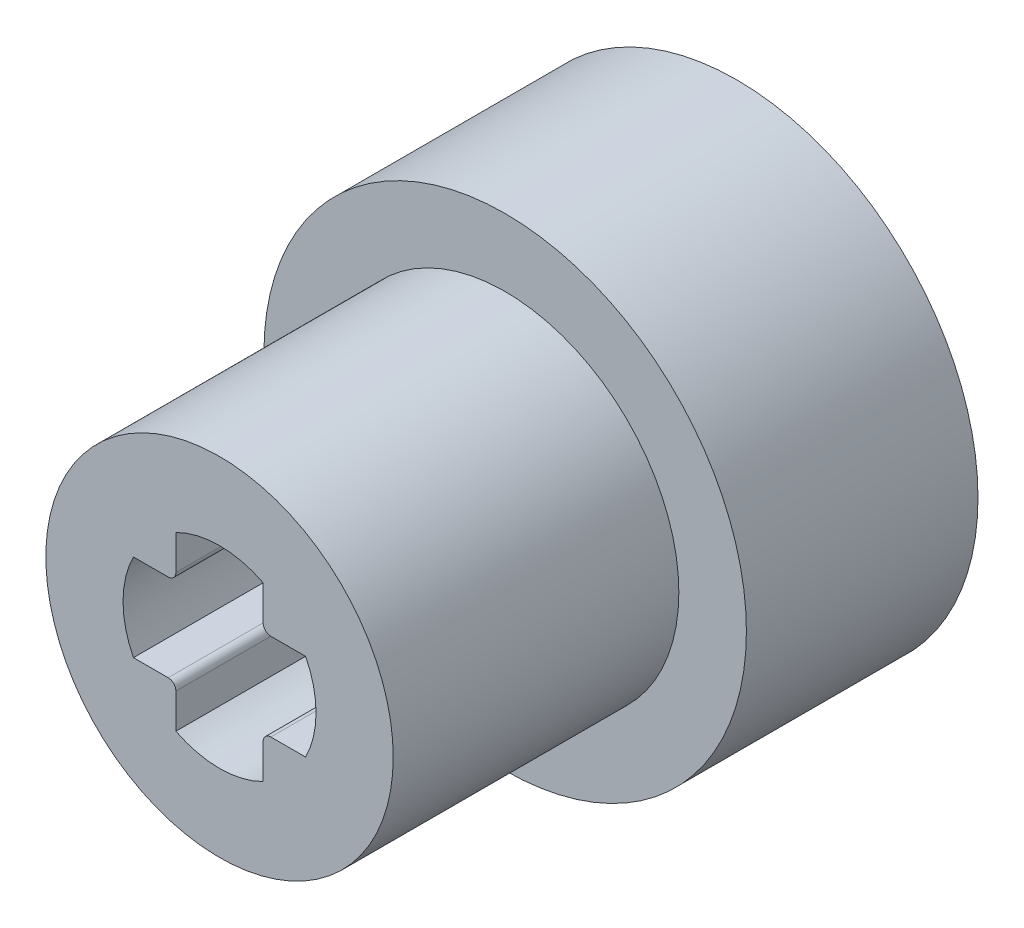
ISO-10303-21;
HEADER;
FILE_DESCRIPTION(('STEP AP214'),'2;1');
FILE_NAME('part.step','',(''),(''),'','','');
FILE_SCHEMA(('AUTOMOTIVE_DESIGN { 1 0 10303 214 1 1 1 1 }'));
ENDSEC;
DATA;
#1=APPLICATION_CONTEXT('core data for automotive mechanical design processes');
#2=APPLICATION_PROTOCOL_DEFINITION('international standard','automotive_design',2000,#1);
#3=PRODUCT_CONTEXT('',#1,'mechanical');
#4=PRODUCT('Part','Part','',(#3));
#5=PRODUCT_RELATED_PRODUCT_CATEGORY('part','',(#4));
#6=PRODUCT_DEFINITION_FORMATION('','',#4);
#7=PRODUCT_DEFINITION_CONTEXT('part definition',#1,'design');
#8=PRODUCT_DEFINITION('design','',#6,#7);
#9=PRODUCT_DEFINITION_SHAPE('','',#8);
#10=(LENGTH_UNIT() NAMED_UNIT(*) SI_UNIT(.MILLI.,.METRE.));
#11=(NAMED_UNIT(*) PLANE_ANGLE_UNIT() SI_UNIT($,.RADIAN.));
#12=(NAMED_UNIT(*) SI_UNIT($,.STERADIAN.) SOLID_ANGLE_UNIT());
#13=UNCERTAINTY_MEASURE_WITH_UNIT(LENGTH_MEASURE(1.E-05),#10,'distance_accuracy_value','');
#14=(GEOMETRIC_REPRESENTATION_CONTEXT(3) GLOBAL_UNCERTAINTY_ASSIGNED_CONTEXT((#13)) GLOBAL_UNIT_ASSIGNED_CONTEXT((#10,
#11,#12)) REPRESENTATION_CONTEXT('',''));
#15=CARTESIAN_POINT('',(0.,0.,0.));
#16=DIRECTION('',(0.,0.,1.));
#17=DIRECTION('',(1.,0.,0.));
#18=AXIS2_PLACEMENT_3D('',#15,#16,#17);
#19=CARTESIAN_POINT('',(0.,0.,0.));
#20=DIRECTION('',(0.,0.,1.));
#21=DIRECTION('',(1.,0.,0.));
#22=AXIS2_PLACEMENT_3D('',#19,#20,#21);
#23=PLANE('',#22);
#24=CARTESIAN_POINT('',(0.,0.,0.));
#25=DIRECTION('',(0.,0.,1.));
#26=DIRECTION('',(1.,0.,0.));
#27=AXIS2_PLACEMENT_3D('',#24,#25,#26);
#28=CIRCLE('',#27,6.25);
#29=CARTESIAN_POINT('',(6.25,0.,0.));
#30=VERTEX_POINT('',#29);
#31=EDGE_CURVE('E298',#30,#30,#28,.T.);
#32=ORIENTED_EDGE('',*,*,#31,.F.);
#33=EDGE_LOOP('',(#32));
#34=FACE_BOUND('',#33,.T.);
#35=CARTESIAN_POINT('',(0.,0.,0.));
#36=DIRECTION('',(0.,0.,1.));
#37=DIRECTION('',(1.,0.,0.));
#38=AXIS2_PLACEMENT_3D('',#35,#36,#37);
#39=CIRCLE('',#38,1.25);
#40=CARTESIAN_POINT('',(1.25,0.,0.));
#41=VERTEX_POINT('',#40);
#42=EDGE_CURVE('E304',#41,#41,#39,.T.);
#43=ORIENTED_EDGE('',*,*,#42,.T.);
#44=EDGE_LOOP('',(#43));
#45=FACE_BOUND('',#44,.T.);
#46=ADVANCED_FACE('F95',(#34,#45),#23,.F.);
#47=CARTESIAN_POINT('',(0.,0.,5.));
#48=DIRECTION('',(0.,0.,-1.));
#49=DIRECTION('',(-1.,0.,0.));
#50=AXIS2_PLACEMENT_3D('',#47,#48,#49);
#51=CYLINDRICAL_SURFACE('',#50,6.25);
#52=ORIENTED_EDGE('',*,*,#31,.T.);
#53=EDGE_LOOP('',(#52));
#54=FACE_BOUND('',#53,.T.);
#55=CARTESIAN_POINT('',(0.,0.,6.));
#56=DIRECTION('',(0.,0.,1.));
#57=DIRECTION('',(1.,0.,0.));
#58=AXIS2_PLACEMENT_3D('',#55,#56,#57);
#59=CIRCLE('',#58,6.25);
#60=CARTESIAN_POINT('',(6.25,0.,6.));
#61=VERTEX_POINT('',#60);
#62=EDGE_CURVE('E293',#61,#61,#59,.T.);
#63=ORIENTED_EDGE('',*,*,#62,.F.);
#64=EDGE_LOOP('',(#63));
#65=FACE_BOUND('',#64,.T.);
#66=ADVANCED_FACE('F386',(#54,#65),#51,.T.);
#67=CARTESIAN_POINT('',(0.,0.,5.));
#68=DIRECTION('',(0.,0.,-1.));
#69=DIRECTION('',(-1.,0.,0.));
#70=AXIS2_PLACEMENT_3D('',#67,#68,#69);
#71=CYLINDRICAL_SURFACE('',#70,1.25);
#72=CARTESIAN_POINT('',(0.,0.,5.));
#73=DIRECTION('',(0.,0.,1.));
#74=DIRECTION('',(1.,0.,0.));
#75=AXIS2_PLACEMENT_3D('',#72,#73,#74);
#76=CIRCLE('',#75,1.25);
#77=CARTESIAN_POINT('',(1.25,0.,5.));
#78=VERTEX_POINT('',#77);
#79=EDGE_CURVE('E301',#78,#78,#76,.T.);
#80=ORIENTED_EDGE('',*,*,#79,.T.);
#81=EDGE_LOOP('',(#80));
#82=FACE_BOUND('',#81,.T.);
#83=ORIENTED_EDGE('',*,*,#42,.F.);
#84=EDGE_LOOP('',(#83));
#85=FACE_BOUND('',#84,.T.);
#86=ADVANCED_FACE('F392',(#82,#85),#71,.F.);
#87=CARTESIAN_POINT('',(0.,0.,5.));
#88=DIRECTION('',(0.,0.,1.));
#89=DIRECTION('',(1.,0.,0.));
#90=AXIS2_PLACEMENT_3D('',#87,#88,#89);
#91=PLANE('',#90);
#92=ORIENTED_EDGE('',*,*,#79,.F.);
#93=EDGE_LOOP('',(#92));
#94=FACE_BOUND('',#93,.T.);
#95=ADVANCED_FACE('F549',(#94),#91,.F.);
#96=CARTESIAN_POINT('',(0.,0.,6.));
#97=DIRECTION('',(0.,0.,1.));
#98=DIRECTION('',(1.,0.,0.));
#99=AXIS2_PLACEMENT_3D('',#96,#97,#98);
#100=PLANE('',#99);
#101=CARTESIAN_POINT('',(0.,0.,6.));
#102=DIRECTION('',(0.,0.,1.));
#103=DIRECTION('',(1.,0.,0.));
#104=AXIS2_PLACEMENT_3D('',#101,#102,#103);
#105=CIRCLE('',#104,4.5);
#106=CARTESIAN_POINT('',(4.5,0.,6.));
#107=VERTEX_POINT('',#106);
#108=EDGE_CURVE('E294',#107,#107,#105,.T.);
#109=ORIENTED_EDGE('',*,*,#108,.F.);
#110=EDGE_LOOP('',(#109));
#111=FACE_BOUND('',#110,.T.);
#112=ORIENTED_EDGE('',*,*,#62,.T.);
#113=EDGE_LOOP('',(#112));
#114=FACE_BOUND('',#113,.T.);
#115=ADVANCED_FACE('F539',(#111,#114),#100,.T.);
#116=CARTESIAN_POINT('',(0.,0.,13.4));
#117=DIRECTION('',(0.,0.,-1.));
#118=DIRECTION('',(-1.,0.,0.));
#119=AXIS2_PLACEMENT_3D('',#116,#117,#118);
#120=CYLINDRICAL_SURFACE('',#119,4.5);
#121=CARTESIAN_POINT('',(0.,0.,13.4));
#122=DIRECTION('',(0.,0.,1.));
#123=DIRECTION('',(1.,0.,0.));
#124=AXIS2_PLACEMENT_3D('',#121,#122,#123);
#125=CIRCLE('',#124,4.5);
#126=CARTESIAN_POINT('',(4.5,0.,13.4));
#127=VERTEX_POINT('',#126);
#128=EDGE_CURVE('E233',#127,#127,#125,.T.);
#129=ORIENTED_EDGE('',*,*,#128,.F.);
#130=EDGE_LOOP('',(#129));
#131=FACE_BOUND('',#130,.T.);
#132=ORIENTED_EDGE('',*,*,#108,.T.);
#133=EDGE_LOOP('',(#132));
#134=FACE_BOUND('',#133,.T.);
#135=ADVANCED_FACE('F505',(#131,#134),#120,.T.);
#136=CARTESIAN_POINT('',(0.,0.,13.4));
#137=DIRECTION('',(0.,0.,1.));
#138=DIRECTION('',(1.,0.,0.));
#139=AXIS2_PLACEMENT_3D('',#136,#137,#138);
#140=PLANE('',#139);
#141=DIRECTION('',(0.,-1.,0.));
#142=VECTOR('',#141,1.);
#143=CARTESIAN_POINT('',(-1.13002976164114,0.,13.4));
#144=LINE('',#143,#142);
#145=CARTESIAN_POINT('',(-1.13002976164114,-1.33002976164114,13.4));
#146=VERTEX_POINT('',#145);
#147=CARTESIAN_POINT('',(-1.13002976164115,-2.23002976164114,13.4));
#148=VERTEX_POINT('',#147);
#149=EDGE_CURVE('E222',#146,#148,#144,.T.);
#150=ORIENTED_EDGE('',*,*,#149,.F.);
#151=CARTESIAN_POINT('',(-1.33002976164114,-1.33002976164114,13.4));
#152=DIRECTION('',(0.,0.,1.));
#153=DIRECTION('',(1.,0.,0.));
#154=AXIS2_PLACEMENT_3D('',#151,#152,#153);
#155=CIRCLE('',#154,0.2);
#156=CARTESIAN_POINT('',(-1.33002976164114,-1.13002976164114,13.4));
#157=VERTEX_POINT('',#156);
#158=EDGE_CURVE('E319',#146,#157,#155,.T.);
#159=ORIENTED_EDGE('',*,*,#158,.T.);
#160=DIRECTION('',(-1.,0.,0.));
#161=VECTOR('',#160,1.);
#162=CARTESIAN_POINT('',(0.,-1.13002976164114,13.4));
#163=LINE('',#162,#161);
#164=CARTESIAN_POINT('',(-2.23002976164114,-1.13002976164114,13.4));
#165=VERTEX_POINT('',#164);
#166=EDGE_CURVE('E288',#157,#165,#163,.T.);
#167=ORIENTED_EDGE('',*,*,#166,.T.);
#168=CARTESIAN_POINT('',(0.,0.,13.4));
#169=DIRECTION('',(0.,0.,1.));
#170=DIRECTION('',(1.,0.,0.));
#171=AXIS2_PLACEMENT_3D('',#168,#169,#170);
#172=CIRCLE('',#171,2.5);
#173=CARTESIAN_POINT('',(-2.23002976164114,1.13002976164114,13.4));
#174=VERTEX_POINT('',#173);
#175=EDGE_CURVE('E249',#174,#165,#172,.T.);
#176=ORIENTED_EDGE('',*,*,#175,.F.);
#177=DIRECTION('',(-1.,0.,0.));
#178=VECTOR('',#177,1.);
#179=CARTESIAN_POINT('',(0.,1.13002976164114,13.4));
#180=LINE('',#179,#178);
#181=CARTESIAN_POINT('',(-1.33002976164114,1.13002976164114,13.4));
#182=VERTEX_POINT('',#181);
#183=EDGE_CURVE('E287',#182,#174,#180,.T.);
#184=ORIENTED_EDGE('',*,*,#183,.F.);
#185=CARTESIAN_POINT('',(-1.33002976164114,1.33002976164114,13.4));
#186=DIRECTION('',(0.,0.,1.));
#187=DIRECTION('',(1.,0.,0.));
#188=AXIS2_PLACEMENT_3D('',#185,#186,#187);
#189=CIRCLE('',#188,0.2);
#190=CARTESIAN_POINT('',(-1.13002976164114,1.33002976164114,13.4));
#191=VERTEX_POINT('',#190);
#192=EDGE_CURVE('E315',#182,#191,#189,.T.);
#193=ORIENTED_EDGE('',*,*,#192,.T.);
#194=CARTESIAN_POINT('',(-1.13002976164114,2.23002976164114,13.4));
#195=VERTEX_POINT('',#194);
#196=EDGE_CURVE('E275',#195,#191,#144,.T.);
#197=ORIENTED_EDGE('',*,*,#196,.F.);
#198=CARTESIAN_POINT('',(0.,0.,13.4));
#199=DIRECTION('',(0.,0.,1.));
#200=DIRECTION('',(1.,0.,0.));
#201=AXIS2_PLACEMENT_3D('',#198,#199,#200);
#202=CIRCLE('',#201,2.5);
#203=CARTESIAN_POINT('',(1.13002976164115,2.23002976164114,13.4));
#204=VERTEX_POINT('',#203);
#205=EDGE_CURVE('E239',#204,#195,#202,.T.);
#206=ORIENTED_EDGE('',*,*,#205,.F.);
#207=DIRECTION('',(0.,-1.,0.));
#208=VECTOR('',#207,1.);
#209=CARTESIAN_POINT('',(1.13002976164114,0.,13.4));
#210=LINE('',#209,#208);
#211=CARTESIAN_POINT('',(1.13002976164114,1.33002976164114,13.4));
#212=VERTEX_POINT('',#211);
#213=EDGE_CURVE('E279',#204,#212,#210,.T.);
#214=ORIENTED_EDGE('',*,*,#213,.T.);
#215=CARTESIAN_POINT('',(1.33002976164114,1.33002976164114,13.4));
#216=DIRECTION('',(0.,0.,1.));
#217=DIRECTION('',(1.,0.,0.));
#218=AXIS2_PLACEMENT_3D('',#215,#216,#217);
#219=CIRCLE('',#218,0.2);
#220=CARTESIAN_POINT('',(1.33002976164114,1.13002976164114,13.4));
#221=VERTEX_POINT('',#220);
#222=EDGE_CURVE('E313',#212,#221,#219,.T.);
#223=ORIENTED_EDGE('',*,*,#222,.T.);
#224=CARTESIAN_POINT('',(2.23002976164114,1.13002976164114,13.4));
#225=VERTEX_POINT('',#224);
#226=EDGE_CURVE('E289',#225,#221,#180,.T.);
#227=ORIENTED_EDGE('',*,*,#226,.F.);
#228=CARTESIAN_POINT('',(0.,0.,13.4));
#229=DIRECTION('',(0.,0.,1.));
#230=DIRECTION('',(1.,0.,0.));
#231=AXIS2_PLACEMENT_3D('',#228,#229,#230);
#232=CIRCLE('',#231,2.5);
#233=CARTESIAN_POINT('',(2.23002976164114,-1.13002976164115,13.4));
#234=VERTEX_POINT('',#233);
#235=EDGE_CURVE('E213',#234,#225,#232,.T.);
#236=ORIENTED_EDGE('',*,*,#235,.F.);
#237=CARTESIAN_POINT('',(1.33002976164114,-1.13002976164114,13.4));
#238=VERTEX_POINT('',#237);
#239=EDGE_CURVE('E284',#234,#238,#163,.T.);
#240=ORIENTED_EDGE('',*,*,#239,.T.);
#241=CARTESIAN_POINT('',(1.33002976164114,-1.33002976164114,13.4));
#242=DIRECTION('',(0.,0.,1.));
#243=DIRECTION('',(1.,0.,0.));
#244=AXIS2_PLACEMENT_3D('',#241,#242,#243);
#245=CIRCLE('',#244,0.2);
#246=CARTESIAN_POINT('',(1.13002976164114,-1.33002976164114,13.4));
#247=VERTEX_POINT('',#246);
#248=EDGE_CURVE('E317',#238,#247,#245,.T.);
#249=ORIENTED_EDGE('',*,*,#248,.T.);
#250=CARTESIAN_POINT('',(1.13002976164114,-2.23002976164114,13.4));
#251=VERTEX_POINT('',#250);
#252=EDGE_CURVE('E278',#247,#251,#210,.T.);
#253=ORIENTED_EDGE('',*,*,#252,.T.);
#254=CARTESIAN_POINT('',(0.,0.,13.4));
#255=DIRECTION('',(0.,0.,1.));
#256=DIRECTION('',(1.,0.,0.));
#257=AXIS2_PLACEMENT_3D('',#254,#255,#256);
#258=CIRCLE('',#257,2.5);
#259=EDGE_CURVE('E261',#148,#251,#258,.T.);
#260=ORIENTED_EDGE('',*,*,#259,.F.);
#261=EDGE_LOOP('',(#150,#159,#167,#176,#184,#193,#197,#206,#214,#223,#227,#236,#240,#249,#253,#260));
#262=FACE_BOUND('',#261,.T.);
#263=ORIENTED_EDGE('',*,*,#128,.T.);
#264=EDGE_LOOP('',(#263));
#265=FACE_BOUND('',#264,.T.);
#266=ADVANCED_FACE('F352',(#262,#265),#140,.T.);
#267=CARTESIAN_POINT('',(0.,0.,6.));
#268=DIRECTION('',(0.,0.,1.));
#269=DIRECTION('',(1.,0.,0.));
#270=AXIS2_PLACEMENT_3D('',#267,#268,#269);
#271=CYLINDRICAL_SURFACE('',#270,2.5);
#272=ORIENTED_EDGE('',*,*,#235,.T.);
#273=DIRECTION('',(0.,0.,1.));
#274=VECTOR('',#273,1.);
#275=CARTESIAN_POINT('',(2.23002976164114,1.13002976164114,6.));
#276=LINE('',#275,#274);
#277=CARTESIAN_POINT('',(2.23002976164114,1.13002976164114,6.));
#278=VERTEX_POINT('',#277);
#279=EDGE_CURVE('E207',#278,#225,#276,.T.);
#280=ORIENTED_EDGE('',*,*,#279,.F.);
#281=CARTESIAN_POINT('',(0.,0.,6.));
#282=DIRECTION('',(0.,0.,1.));
#283=DIRECTION('',(1.,0.,0.));
#284=AXIS2_PLACEMENT_3D('',#281,#282,#283);
#285=CIRCLE('',#284,2.5);
#286=CARTESIAN_POINT('',(2.23002976164114,-1.13002976164115,6.));
#287=VERTEX_POINT('',#286);
#288=EDGE_CURVE('E211',#287,#278,#285,.T.);
#289=ORIENTED_EDGE('',*,*,#288,.F.);
#290=DIRECTION('',(0.,0.,1.));
#291=VECTOR('',#290,1.);
#292=CARTESIAN_POINT('',(2.23002976164114,-1.13002976164115,6.));
#293=LINE('',#292,#291);
#294=EDGE_CURVE('E217',#287,#234,#293,.T.);
#295=ORIENTED_EDGE('',*,*,#294,.T.);
#296=EDGE_LOOP('',(#272,#280,#289,#295));
#297=FACE_BOUND('',#296,.T.);
#298=ADVANCED_FACE('F209',(#297),#271,.F.);
#299=CARTESIAN_POINT('',(0.,0.,6.));
#300=DIRECTION('',(0.,0.,1.));
#301=DIRECTION('',(1.,0.,0.));
#302=AXIS2_PLACEMENT_3D('',#299,#300,#301);
#303=PLANE('',#302);
#304=ORIENTED_EDGE('',*,*,#288,.T.);
#305=DIRECTION('',(-1.,0.,0.));
#306=VECTOR('',#305,1.);
#307=CARTESIAN_POINT('',(0.,1.13002976164114,6.));
#308=LINE('',#307,#306);
#309=CARTESIAN_POINT('',(1.33002976164114,1.13002976164114,6.));
#310=VERTEX_POINT('',#309);
#311=EDGE_CURVE('E219',#278,#310,#308,.T.);
#312=ORIENTED_EDGE('',*,*,#311,.T.);
#313=CARTESIAN_POINT('',(1.33002976164114,1.33002976164114,6.));
#314=DIRECTION('',(0.,0.,1.));
#315=DIRECTION('',(1.,0.,0.));
#316=AXIS2_PLACEMENT_3D('',#313,#314,#315);
#317=CIRCLE('',#316,0.2);
#318=CARTESIAN_POINT('',(1.13002976164114,1.33002976164114,6.));
#319=VERTEX_POINT('',#318);
#320=EDGE_CURVE('E12',#310,#319,#317,.F.);
#321=ORIENTED_EDGE('',*,*,#320,.T.);
#322=DIRECTION('',(0.,-1.,0.));
#323=VECTOR('',#322,1.);
#324=CARTESIAN_POINT('',(1.13002976164114,0.,6.));
#325=LINE('',#324,#323);
#326=CARTESIAN_POINT('',(1.13002976164115,2.23002976164114,6.));
#327=VERTEX_POINT('',#326);
#328=EDGE_CURVE('E264',#327,#319,#325,.T.);
#329=ORIENTED_EDGE('',*,*,#328,.F.);
#330=CARTESIAN_POINT('',(0.,0.,6.));
#331=DIRECTION('',(0.,0.,1.));
#332=DIRECTION('',(1.,0.,0.));
#333=AXIS2_PLACEMENT_3D('',#330,#331,#332);
#334=CIRCLE('',#333,2.5);
#335=CARTESIAN_POINT('',(-1.13002976164114,2.23002976164114,6.));
#336=VERTEX_POINT('',#335);
#337=EDGE_CURVE('E235',#327,#336,#334,.T.);
#338=ORIENTED_EDGE('',*,*,#337,.T.);
#339=DIRECTION('',(0.,-1.,0.));
#340=VECTOR('',#339,1.);
#341=CARTESIAN_POINT('',(-1.13002976164114,0.,6.));
#342=LINE('',#341,#340);
#343=CARTESIAN_POINT('',(-1.13002976164114,1.33002976164114,6.));
#344=VERTEX_POINT('',#343);
#345=EDGE_CURVE('E269',#336,#344,#342,.T.);
#346=ORIENTED_EDGE('',*,*,#345,.T.);
#347=CARTESIAN_POINT('',(-1.33002976164114,1.33002976164114,6.));
#348=DIRECTION('',(0.,0.,1.));
#349=DIRECTION('',(1.,0.,0.));
#350=AXIS2_PLACEMENT_3D('',#347,#348,#349);
#351=CIRCLE('',#350,0.2);
#352=CARTESIAN_POINT('',(-1.33002976164114,1.13002976164114,6.));
#353=VERTEX_POINT('',#352);
#354=EDGE_CURVE('E103',#344,#353,#351,.F.);
#355=ORIENTED_EDGE('',*,*,#354,.T.);
#356=CARTESIAN_POINT('',(-2.23002976164114,1.13002976164114,6.));
#357=VERTEX_POINT('',#356);
#358=EDGE_CURVE('E223',#353,#357,#308,.T.);
#359=ORIENTED_EDGE('',*,*,#358,.T.);
#360=CARTESIAN_POINT('',(0.,0.,6.));
#361=DIRECTION('',(0.,0.,1.));
#362=DIRECTION('',(1.,0.,0.));
#363=AXIS2_PLACEMENT_3D('',#360,#361,#362);
#364=CIRCLE('',#363,2.5);
#365=CARTESIAN_POINT('',(-2.23002976164114,-1.13002976164114,6.));
#366=VERTEX_POINT('',#365);
#367=EDGE_CURVE('E245',#357,#366,#364,.T.);
#368=ORIENTED_EDGE('',*,*,#367,.T.);
#369=DIRECTION('',(-1.,0.,0.));
#370=VECTOR('',#369,1.);
#371=CARTESIAN_POINT('',(0.,-1.13002976164114,6.));
#372=LINE('',#371,#370);
#373=CARTESIAN_POINT('',(-1.33002976164114,-1.13002976164114,6.));
#374=VERTEX_POINT('',#373);
#375=EDGE_CURVE('E282',#374,#366,#372,.T.);
#376=ORIENTED_EDGE('',*,*,#375,.F.);
#377=CARTESIAN_POINT('',(-1.33002976164114,-1.33002976164114,6.));
#378=DIRECTION('',(0.,0.,1.));
#379=DIRECTION('',(1.,0.,0.));
#380=AXIS2_PLACEMENT_3D('',#377,#378,#379);
#381=CIRCLE('',#380,0.2);
#382=CARTESIAN_POINT('',(-1.13002976164114,-1.33002976164114,6.));
#383=VERTEX_POINT('',#382);
#384=EDGE_CURVE('E334',#374,#383,#381,.F.);
#385=ORIENTED_EDGE('',*,*,#384,.T.);
#386=CARTESIAN_POINT('',(-1.13002976164115,-2.23002976164114,6.));
#387=VERTEX_POINT('',#386);
#388=EDGE_CURVE('E273',#383,#387,#342,.T.);
#389=ORIENTED_EDGE('',*,*,#388,.T.);
#390=CARTESIAN_POINT('',(0.,0.,6.));
#391=DIRECTION('',(0.,0.,1.));
#392=DIRECTION('',(1.,0.,0.));
#393=AXIS2_PLACEMENT_3D('',#390,#391,#392);
#394=CIRCLE('',#393,2.5);
#395=CARTESIAN_POINT('',(1.13002976164114,-2.23002976164114,6.));
#396=VERTEX_POINT('',#395);
#397=EDGE_CURVE('E257',#387,#396,#394,.T.);
#398=ORIENTED_EDGE('',*,*,#397,.T.);
#399=CARTESIAN_POINT('',(1.13002976164114,-1.33002976164114,6.));
#400=VERTEX_POINT('',#399);
#401=EDGE_CURVE('E272',#400,#396,#325,.T.);
#402=ORIENTED_EDGE('',*,*,#401,.F.);
#403=CARTESIAN_POINT('',(1.33002976164114,-1.33002976164114,6.));
#404=DIRECTION('',(0.,0.,1.));
#405=DIRECTION('',(1.,0.,0.));
#406=AXIS2_PLACEMENT_3D('',#403,#404,#405);
#407=CIRCLE('',#406,0.2);
#408=CARTESIAN_POINT('',(1.33002976164114,-1.13002976164114,6.));
#409=VERTEX_POINT('',#408);
#410=EDGE_CURVE('E336',#400,#409,#407,.F.);
#411=ORIENTED_EDGE('',*,*,#410,.T.);
#412=EDGE_CURVE('E228',#287,#409,#372,.T.);
#413=ORIENTED_EDGE('',*,*,#412,.F.);
#414=EDGE_LOOP('',(#304,#312,#321,#329,#338,#346,#355,#359,#368,#376,#385,#389,#398,#402,#411,#413));
#415=FACE_BOUND('',#414,.T.);
#416=ADVANCED_FACE('F226',(#415),#303,.T.);
#417=CARTESIAN_POINT('',(0.,0.,6.));
#418=DIRECTION('',(0.,0.,1.));
#419=DIRECTION('',(1.,0.,0.));
#420=AXIS2_PLACEMENT_3D('',#417,#418,#419);
#421=CYLINDRICAL_SURFACE('',#420,2.5);
#422=ORIENTED_EDGE('',*,*,#175,.T.);
#423=DIRECTION('',(0.,0.,1.));
#424=VECTOR('',#423,1.);
#425=CARTESIAN_POINT('',(-2.23002976164114,-1.13002976164114,6.));
#426=LINE('',#425,#424);
#427=EDGE_CURVE('E248',#366,#165,#426,.T.);
#428=ORIENTED_EDGE('',*,*,#427,.F.);
#429=ORIENTED_EDGE('',*,*,#367,.F.);
#430=DIRECTION('',(0.,0.,1.));
#431=VECTOR('',#430,1.);
#432=CARTESIAN_POINT('',(-2.23002976164114,1.13002976164114,6.));
#433=LINE('',#432,#431);
#434=EDGE_CURVE('E242',#357,#174,#433,.T.);
#435=ORIENTED_EDGE('',*,*,#434,.T.);
#436=EDGE_LOOP('',(#422,#428,#429,#435));
#437=FACE_BOUND('',#436,.T.);
#438=ADVANCED_FACE('F376',(#437),#421,.F.);
#439=CARTESIAN_POINT('',(-1.13002976164114,0.,6.));
#440=DIRECTION('',(-1.,0.,0.));
#441=DIRECTION('',(0.,0.,1.));
#442=AXIS2_PLACEMENT_3D('',#439,#440,#441);
#443=PLANE('',#442);
#444=ORIENTED_EDGE('',*,*,#388,.F.);
#445=DIRECTION('',(0.,0.,-1.));
#446=VECTOR('',#445,1.);
#447=CARTESIAN_POINT('',(-1.13002976164114,-1.33002976164114,13.4));
#448=LINE('',#447,#446);
#449=EDGE_CURVE('E311',#383,#146,#448,.F.);
#450=ORIENTED_EDGE('',*,*,#449,.T.);
#451=ORIENTED_EDGE('',*,*,#149,.T.);
#452=DIRECTION('',(0.,0.,1.));
#453=VECTOR('',#452,1.);
#454=CARTESIAN_POINT('',(-1.13002976164115,-2.23002976164114,6.));
#455=LINE('',#454,#453);
#456=EDGE_CURVE('E252',#387,#148,#455,.T.);
#457=ORIENTED_EDGE('',*,*,#456,.F.);
#458=EDGE_LOOP('',(#444,#450,#451,#457));
#459=FACE_BOUND('',#458,.T.);
#460=ADVANCED_FACE('F378',(#459),#443,.F.);
#461=CARTESIAN_POINT('',(0.,-1.13002976164114,6.));
#462=DIRECTION('',(0.,1.,0.));
#463=DIRECTION('',(0.,0.,1.));
#464=AXIS2_PLACEMENT_3D('',#461,#462,#463);
#465=PLANE('',#464);
#466=ORIENTED_EDGE('',*,*,#166,.F.);
#467=DIRECTION('',(0.,0.,-1.));
#468=VECTOR('',#467,1.);
#469=CARTESIAN_POINT('',(-1.33002976164114,-1.13002976164114,6.));
#470=LINE('',#469,#468);
#471=EDGE_CURVE('E297',#157,#374,#470,.T.);
#472=ORIENTED_EDGE('',*,*,#471,.T.);
#473=ORIENTED_EDGE('',*,*,#375,.T.);
#474=ORIENTED_EDGE('',*,*,#427,.T.);
#475=EDGE_LOOP('',(#466,#472,#473,#474));
#476=FACE_BOUND('',#475,.T.);
#477=ADVANCED_FACE('F369',(#476),#465,.T.);
#478=CARTESIAN_POINT('',(0.,1.13002976164114,6.));
#479=DIRECTION('',(0.,1.,0.));
#480=DIRECTION('',(0.,0.,1.));
#481=AXIS2_PLACEMENT_3D('',#478,#479,#480);
#482=PLANE('',#481);
#483=ORIENTED_EDGE('',*,*,#358,.F.);
#484=DIRECTION('',(0.,0.,-1.));
#485=VECTOR('',#484,1.);
#486=CARTESIAN_POINT('',(-1.33002976164114,1.13002976164114,6.));
#487=LINE('',#486,#485);
#488=EDGE_CURVE('E329',#353,#182,#487,.F.);
#489=ORIENTED_EDGE('',*,*,#488,.T.);
#490=ORIENTED_EDGE('',*,*,#183,.T.);
#491=ORIENTED_EDGE('',*,*,#434,.F.);
#492=EDGE_LOOP('',(#483,#489,#490,#491));
#493=FACE_BOUND('',#492,.T.);
#494=ADVANCED_FACE('F344',(#493),#482,.F.);
#495=ORIENTED_EDGE('',*,*,#196,.T.);
#496=DIRECTION('',(0.,0.,-1.));
#497=VECTOR('',#496,1.);
#498=CARTESIAN_POINT('',(-1.13002976164114,1.33002976164114,6.));
#499=LINE('',#498,#497);
#500=EDGE_CURVE('E326',#191,#344,#499,.T.);
#501=ORIENTED_EDGE('',*,*,#500,.T.);
#502=ORIENTED_EDGE('',*,*,#345,.F.);
#503=DIRECTION('',(0.,0.,1.));
#504=VECTOR('',#503,1.);
#505=CARTESIAN_POINT('',(-1.13002976164114,2.23002976164114,6.));
#506=LINE('',#505,#504);
#507=EDGE_CURVE('E238',#336,#195,#506,.T.);
#508=ORIENTED_EDGE('',*,*,#507,.T.);
#509=EDGE_LOOP('',(#495,#501,#502,#508));
#510=FACE_BOUND('',#509,.T.);
#511=ADVANCED_FACE('F357',(#510),#443,.F.);
#512=CARTESIAN_POINT('',(0.,0.,6.));
#513=DIRECTION('',(0.,0.,1.));
#514=DIRECTION('',(1.,0.,0.));
#515=AXIS2_PLACEMENT_3D('',#512,#513,#514);
#516=CYLINDRICAL_SURFACE('',#515,2.5);
#517=ORIENTED_EDGE('',*,*,#259,.T.);
#518=DIRECTION('',(0.,0.,1.));
#519=VECTOR('',#518,1.);
#520=CARTESIAN_POINT('',(1.13002976164114,-2.23002976164114,6.));
#521=LINE('',#520,#519);
#522=EDGE_CURVE('E260',#396,#251,#521,.T.);
#523=ORIENTED_EDGE('',*,*,#522,.F.);
#524=ORIENTED_EDGE('',*,*,#397,.F.);
#525=ORIENTED_EDGE('',*,*,#456,.T.);
#526=EDGE_LOOP('',(#517,#523,#524,#525));
#527=FACE_BOUND('',#526,.T.);
#528=ADVANCED_FACE('F384',(#527),#516,.F.);
#529=CARTESIAN_POINT('',(0.,0.,6.));
#530=DIRECTION('',(0.,0.,1.));
#531=DIRECTION('',(1.,0.,0.));
#532=AXIS2_PLACEMENT_3D('',#529,#530,#531);
#533=CYLINDRICAL_SURFACE('',#532,2.5);
#534=ORIENTED_EDGE('',*,*,#205,.T.);
#535=ORIENTED_EDGE('',*,*,#507,.F.);
#536=ORIENTED_EDGE('',*,*,#337,.F.);
#537=DIRECTION('',(0.,0.,1.));
#538=VECTOR('',#537,1.);
#539=CARTESIAN_POINT('',(1.13002976164115,2.23002976164114,6.));
#540=LINE('',#539,#538);
#541=EDGE_CURVE('E230',#327,#204,#540,.T.);
#542=ORIENTED_EDGE('',*,*,#541,.T.);
#543=EDGE_LOOP('',(#534,#535,#536,#542));
#544=FACE_BOUND('',#543,.T.);
#545=ADVANCED_FACE('F360',(#544),#533,.F.);
#546=CARTESIAN_POINT('',(1.13002976164114,0.,6.));
#547=DIRECTION('',(-1.,0.,0.));
#548=DIRECTION('',(0.,0.,1.));
#549=AXIS2_PLACEMENT_3D('',#546,#547,#548);
#550=PLANE('',#549);
#551=ORIENTED_EDGE('',*,*,#252,.F.);
#552=DIRECTION('',(0.,0.,-1.));
#553=VECTOR('',#552,1.);
#554=CARTESIAN_POINT('',(1.13002976164114,-1.33002976164114,6.));
#555=LINE('',#554,#553);
#556=EDGE_CURVE('E321',#247,#400,#555,.T.);
#557=ORIENTED_EDGE('',*,*,#556,.T.);
#558=ORIENTED_EDGE('',*,*,#401,.T.);
#559=ORIENTED_EDGE('',*,*,#522,.T.);
#560=EDGE_LOOP('',(#551,#557,#558,#559));
#561=FACE_BOUND('',#560,.T.);
#562=ADVANCED_FACE('F367',(#561),#550,.T.);
#563=ORIENTED_EDGE('',*,*,#328,.T.);
#564=DIRECTION('',(0.,0.,-1.));
#565=VECTOR('',#564,1.);
#566=CARTESIAN_POINT('',(1.13002976164114,1.33002976164114,13.4));
#567=LINE('',#566,#565);
#568=EDGE_CURVE('E332',#319,#212,#567,.F.);
#569=ORIENTED_EDGE('',*,*,#568,.T.);
#570=ORIENTED_EDGE('',*,*,#213,.F.);
#571=ORIENTED_EDGE('',*,*,#541,.F.);
#572=EDGE_LOOP('',(#563,#569,#570,#571));
#573=FACE_BOUND('',#572,.T.);
#574=ADVANCED_FACE('F364',(#573),#550,.T.);
#575=ORIENTED_EDGE('',*,*,#412,.T.);
#576=DIRECTION('',(0.,0.,-1.));
#577=VECTOR('',#576,1.);
#578=CARTESIAN_POINT('',(1.33002976164114,-1.13002976164114,6.));
#579=LINE('',#578,#577);
#580=EDGE_CURVE('E324',#409,#238,#579,.F.);
#581=ORIENTED_EDGE('',*,*,#580,.T.);
#582=ORIENTED_EDGE('',*,*,#239,.F.);
#583=ORIENTED_EDGE('',*,*,#294,.F.);
#584=EDGE_LOOP('',(#575,#581,#582,#583));
#585=FACE_BOUND('',#584,.T.);
#586=ADVANCED_FACE('F366',(#585),#465,.T.);
#587=ORIENTED_EDGE('',*,*,#226,.T.);
#588=DIRECTION('',(0.,0.,-1.));
#589=VECTOR('',#588,1.);
#590=CARTESIAN_POINT('',(1.33002976164114,1.13002976164114,6.));
#591=LINE('',#590,#589);
#592=EDGE_CURVE('E221',#221,#310,#591,.T.);
#593=ORIENTED_EDGE('',*,*,#592,.T.);
#594=ORIENTED_EDGE('',*,*,#311,.F.);
#595=ORIENTED_EDGE('',*,*,#279,.T.);
#596=EDGE_LOOP('',(#587,#593,#594,#595));
#597=FACE_BOUND('',#596,.T.);
#598=ADVANCED_FACE('F220',(#597),#482,.F.);
#599=CARTESIAN_POINT('',(-1.33002976164114,-1.33002976164114,6.));
#600=DIRECTION('',(0.,0.,1.));
#601=DIRECTION('',(1.,0.,0.));
#602=AXIS2_PLACEMENT_3D('',#599,#600,#601);
#603=CYLINDRICAL_SURFACE('',#602,0.2);
#604=ORIENTED_EDGE('',*,*,#158,.F.);
#605=ORIENTED_EDGE('',*,*,#449,.F.);
#606=ORIENTED_EDGE('',*,*,#384,.F.);
#607=ORIENTED_EDGE('',*,*,#471,.F.);
#608=EDGE_LOOP('',(#604,#605,#606,#607));
#609=FACE_BOUND('',#608,.T.);
#610=ADVANCED_FACE('F400',(#609),#603,.T.);
#611=CARTESIAN_POINT('',(1.33002976164114,-1.33002976164114,6.));
#612=DIRECTION('',(0.,0.,-1.));
#613=DIRECTION('',(-1.,0.,0.));
#614=AXIS2_PLACEMENT_3D('',#611,#612,#613);
#615=CYLINDRICAL_SURFACE('',#614,0.2);
#616=ORIENTED_EDGE('',*,*,#248,.F.);
#617=ORIENTED_EDGE('',*,*,#580,.F.);
#618=ORIENTED_EDGE('',*,*,#410,.F.);
#619=ORIENTED_EDGE('',*,*,#556,.F.);
#620=EDGE_LOOP('',(#616,#617,#618,#619));
#621=FACE_BOUND('',#620,.T.);
#622=ADVANCED_FACE('F403',(#621),#615,.T.);
#623=CARTESIAN_POINT('',(-1.33002976164114,1.33002976164114,6.));
#624=DIRECTION('',(0.,0.,-1.));
#625=DIRECTION('',(-1.,0.,0.));
#626=AXIS2_PLACEMENT_3D('',#623,#624,#625);
#627=CYLINDRICAL_SURFACE('',#626,0.2);
#628=ORIENTED_EDGE('',*,*,#192,.F.);
#629=ORIENTED_EDGE('',*,*,#488,.F.);
#630=ORIENTED_EDGE('',*,*,#354,.F.);
#631=ORIENTED_EDGE('',*,*,#500,.F.);
#632=EDGE_LOOP('',(#628,#629,#630,#631));
#633=FACE_BOUND('',#632,.T.);
#634=ADVANCED_FACE('F348',(#633),#627,.T.);
#635=CARTESIAN_POINT('',(1.33002976164114,1.33002976164114,6.));
#636=DIRECTION('',(0.,0.,1.));
#637=DIRECTION('',(1.,0.,0.));
#638=AXIS2_PLACEMENT_3D('',#635,#636,#637);
#639=CYLINDRICAL_SURFACE('',#638,0.2);
#640=ORIENTED_EDGE('',*,*,#222,.F.);
#641=ORIENTED_EDGE('',*,*,#568,.F.);
#642=ORIENTED_EDGE('',*,*,#320,.F.);
#643=ORIENTED_EDGE('',*,*,#592,.F.);
#644=EDGE_LOOP('',(#640,#641,#642,#643));
#645=FACE_BOUND('',#644,.T.);
#646=ADVANCED_FACE('F97',(#645),#639,.T.);
#647=CLOSED_SHELL('',(#46,#66,#86,#95,#115,#135,#266,#298,#416,#438,#460,#477,#494,#511,#528,
#545,#562,#574,#586,#598,#610,#622,#634,#646));
#648=MANIFOLD_SOLID_BREP('B2',#647);
#649=ADVANCED_BREP_SHAPE_REPRESENTATION('',(#18,#648),#14);
#650=SHAPE_DEFINITION_REPRESENTATION(#9,#649);
ENDSEC;
END-ISO-10303-21;
